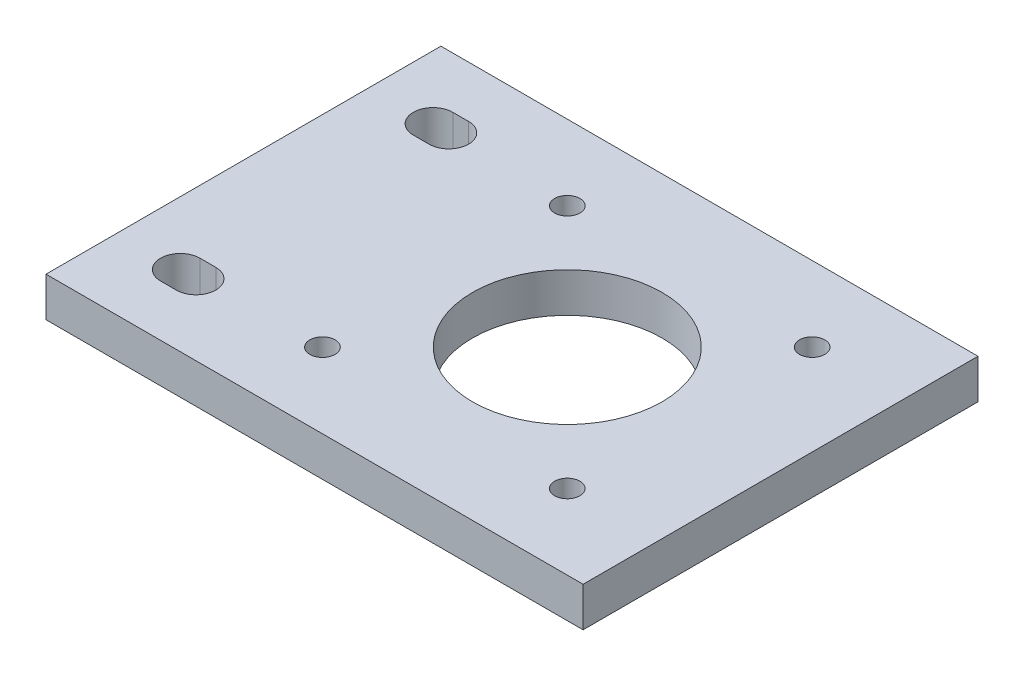
ISO-10303-21;
HEADER;
FILE_DESCRIPTION(('STEP AP214'),'2;1');
FILE_NAME('part.step','',(''),(''),'','','');
FILE_SCHEMA(('AUTOMOTIVE_DESIGN { 1 0 10303 214 1 1 1 1 }'));
ENDSEC;
DATA;
#1=APPLICATION_CONTEXT('core data for automotive mechanical design processes');
#2=APPLICATION_PROTOCOL_DEFINITION('international standard','automotive_design',2000,#1);
#3=PRODUCT_CONTEXT('',#1,'mechanical');
#4=PRODUCT('Part','Part','',(#3));
#5=PRODUCT_RELATED_PRODUCT_CATEGORY('part','',(#4));
#6=PRODUCT_DEFINITION_FORMATION('','',#4);
#7=PRODUCT_DEFINITION_CONTEXT('part definition',#1,'design');
#8=PRODUCT_DEFINITION('design','',#6,#7);
#9=PRODUCT_DEFINITION_SHAPE('','',#8);
#10=(LENGTH_UNIT() NAMED_UNIT(*) SI_UNIT(.MILLI.,.METRE.));
#11=(NAMED_UNIT(*) PLANE_ANGLE_UNIT() SI_UNIT($,.RADIAN.));
#12=(NAMED_UNIT(*) SI_UNIT($,.STERADIAN.) SOLID_ANGLE_UNIT());
#13=UNCERTAINTY_MEASURE_WITH_UNIT(LENGTH_MEASURE(1.E-05),#10,'distance_accuracy_value','');
#14=(GEOMETRIC_REPRESENTATION_CONTEXT(3) GLOBAL_UNCERTAINTY_ASSIGNED_CONTEXT((#13)) GLOBAL_UNIT_ASSIGNED_CONTEXT((#10,
#11,#12)) REPRESENTATION_CONTEXT('',''));
#15=CARTESIAN_POINT('',(0.,0.,0.));
#16=DIRECTION('',(0.,0.,1.));
#17=DIRECTION('',(1.,0.,0.));
#18=AXIS2_PLACEMENT_3D('',#15,#16,#17);
#19=CARTESIAN_POINT('',(0.,5.,0.));
#20=DIRECTION('',(0.,1.,0.));
#21=DIRECTION('',(0.,0.,1.));
#22=AXIS2_PLACEMENT_3D('',#19,#20,#21);
#23=PLANE('',#22);
#24=CARTESIAN_POINT('',(56.5,5.,40.5));
#25=DIRECTION('',(0.,1.,0.));
#26=DIRECTION('',(0.,0.,1.));
#27=AXIS2_PLACEMENT_3D('',#24,#25,#26);
#28=CIRCLE('',#27,1.60000000000001);
#29=CARTESIAN_POINT('',(56.5,5.,42.1));
#30=VERTEX_POINT('',#29);
#31=EDGE_CURVE('E232',#30,#30,#28,.T.);
#32=ORIENTED_EDGE('',*,*,#31,.F.);
#33=EDGE_LOOP('',(#32));
#34=FACE_BOUND('',#33,.T.);
#35=CARTESIAN_POINT('',(25.5,5.,9.5));
#36=DIRECTION('',(0.,1.,0.));
#37=DIRECTION('',(0.,0.,1.));
#38=AXIS2_PLACEMENT_3D('',#35,#36,#37);
#39=CIRCLE('',#38,1.6);
#40=CARTESIAN_POINT('',(25.5,5.,11.1));
#41=VERTEX_POINT('',#40);
#42=EDGE_CURVE('E248',#41,#41,#39,.T.);
#43=ORIENTED_EDGE('',*,*,#42,.F.);
#44=EDGE_LOOP('',(#43));
#45=FACE_BOUND('',#44,.T.);
#46=DIRECTION('',(0.,0.,1.));
#47=VECTOR('',#46,1.);
#48=CARTESIAN_POINT('',(0.,5.,0.));
#49=LINE('',#48,#47);
#50=CARTESIAN_POINT('',(0.,5.,0.));
#51=VERTEX_POINT('',#50);
#52=CARTESIAN_POINT('',(0.,5.,50.));
#53=VERTEX_POINT('',#52);
#54=EDGE_CURVE('E264',#51,#53,#49,.T.);
#55=ORIENTED_EDGE('',*,*,#54,.T.);
#56=DIRECTION('',(1.,0.,0.));
#57=VECTOR('',#56,1.);
#58=CARTESIAN_POINT('',(0.,5.,50.));
#59=LINE('',#58,#57);
#60=CARTESIAN_POINT('',(68.,5.,50.));
#61=VERTEX_POINT('',#60);
#62=EDGE_CURVE('E268',#53,#61,#59,.T.);
#63=ORIENTED_EDGE('',*,*,#62,.T.);
#64=DIRECTION('',(0.,0.,-1.));
#65=VECTOR('',#64,1.);
#66=CARTESIAN_POINT('',(68.,5.,0.));
#67=LINE('',#66,#65);
#68=CARTESIAN_POINT('',(68.,5.,0.));
#69=VERTEX_POINT('',#68);
#70=EDGE_CURVE('E272',#61,#69,#67,.T.);
#71=ORIENTED_EDGE('',*,*,#70,.T.);
#72=DIRECTION('',(-1.,0.,0.));
#73=VECTOR('',#72,1.);
#74=CARTESIAN_POINT('',(0.,5.,0.));
#75=LINE('',#74,#73);
#76=EDGE_CURVE('E275',#69,#51,#75,.T.);
#77=ORIENTED_EDGE('',*,*,#76,.T.);
#78=EDGE_LOOP('',(#55,#63,#71,#77));
#79=FACE_BOUND('',#78,.T.);
#80=CARTESIAN_POINT('',(41.,5.,25.));
#81=DIRECTION('',(0.,1.,0.));
#82=DIRECTION('',(0.,0.,1.));
#83=AXIS2_PLACEMENT_3D('',#80,#81,#82);
#84=CIRCLE('',#83,12.);
#85=CARTESIAN_POINT('',(41.,5.,37.));
#86=VERTEX_POINT('',#85);
#87=EDGE_CURVE('E256',#86,#86,#84,.T.);
#88=ORIENTED_EDGE('',*,*,#87,.F.);
#89=EDGE_LOOP('',(#88));
#90=FACE_BOUND('',#89,.T.);
#91=CARTESIAN_POINT('',(56.5,5.,9.5));
#92=DIRECTION('',(0.,1.,0.));
#93=DIRECTION('',(0.,0.,1.));
#94=AXIS2_PLACEMENT_3D('',#91,#92,#93);
#95=CIRCLE('',#94,1.6);
#96=CARTESIAN_POINT('',(56.5,5.,11.1));
#97=VERTEX_POINT('',#96);
#98=EDGE_CURVE('E240',#97,#97,#95,.T.);
#99=ORIENTED_EDGE('',*,*,#98,.F.);
#100=EDGE_LOOP('',(#99));
#101=FACE_BOUND('',#100,.T.);
#102=CARTESIAN_POINT('',(25.5,5.,40.5));
#103=DIRECTION('',(0.,1.,0.));
#104=DIRECTION('',(0.,0.,1.));
#105=AXIS2_PLACEMENT_3D('',#102,#103,#104);
#106=CIRCLE('',#105,1.6);
#107=CARTESIAN_POINT('',(25.5,5.,42.1));
#108=VERTEX_POINT('',#107);
#109=EDGE_CURVE('E224',#108,#108,#106,.T.);
#110=ORIENTED_EDGE('',*,*,#109,.F.);
#111=EDGE_LOOP('',(#110));
#112=FACE_BOUND('',#111,.T.);
#113=DIRECTION('',(1.,0.,0.));
#114=VECTOR('',#113,1.);
#115=CARTESIAN_POINT('',(8.,5.,11.5));
#116=LINE('',#115,#114);
#117=CARTESIAN_POINT('',(8.,5.,11.5));
#118=VERTEX_POINT('',#117);
#119=CARTESIAN_POINT('',(10.,5.,11.5));
#120=VERTEX_POINT('',#119);
#121=EDGE_CURVE('E184',#118,#120,#116,.T.);
#122=ORIENTED_EDGE('',*,*,#121,.F.);
#123=CARTESIAN_POINT('',(8.,5.,9.));
#124=DIRECTION('',(0.,1.,0.));
#125=DIRECTION('',(0.,0.,1.));
#126=AXIS2_PLACEMENT_3D('',#123,#124,#125);
#127=CIRCLE('',#126,2.5);
#128=CARTESIAN_POINT('',(8.,5.,6.5));
#129=VERTEX_POINT('',#128);
#130=EDGE_CURVE('E181',#129,#118,#127,.T.);
#131=ORIENTED_EDGE('',*,*,#130,.F.);
#132=DIRECTION('',(-1.,0.,0.));
#133=VECTOR('',#132,1.);
#134=CARTESIAN_POINT('',(8.,5.,6.5));
#135=LINE('',#134,#133);
#136=CARTESIAN_POINT('',(10.,5.,6.5));
#137=VERTEX_POINT('',#136);
#138=EDGE_CURVE('E192',#137,#129,#135,.T.);
#139=ORIENTED_EDGE('',*,*,#138,.F.);
#140=CARTESIAN_POINT('',(10.,5.,9.));
#141=DIRECTION('',(0.,1.,0.));
#142=DIRECTION('',(0.,0.,1.));
#143=AXIS2_PLACEMENT_3D('',#140,#141,#142);
#144=CIRCLE('',#143,2.5);
#145=EDGE_CURVE('E188',#120,#137,#144,.T.);
#146=ORIENTED_EDGE('',*,*,#145,.F.);
#147=EDGE_LOOP('',(#122,#131,#139,#146));
#148=FACE_BOUND('',#147,.T.);
#149=DIRECTION('',(1.,0.,0.));
#150=VECTOR('',#149,1.);
#151=CARTESIAN_POINT('',(8.00000000000001,5.,43.5));
#152=LINE('',#151,#150);
#153=CARTESIAN_POINT('',(8.00000000000001,5.,43.5));
#154=VERTEX_POINT('',#153);
#155=CARTESIAN_POINT('',(10.,5.,43.5));
#156=VERTEX_POINT('',#155);
#157=EDGE_CURVE('E142',#154,#156,#152,.T.);
#158=ORIENTED_EDGE('',*,*,#157,.F.);
#159=CARTESIAN_POINT('',(8.00000000000001,5.,41.));
#160=DIRECTION('',(0.,1.,0.));
#161=DIRECTION('',(0.,0.,1.));
#162=AXIS2_PLACEMENT_3D('',#159,#160,#161);
#163=CIRCLE('',#162,2.5);
#164=CARTESIAN_POINT('',(8.00000000000001,5.,38.5));
#165=VERTEX_POINT('',#164);
#166=EDGE_CURVE('E133',#165,#154,#163,.T.);
#167=ORIENTED_EDGE('',*,*,#166,.F.);
#168=DIRECTION('',(-1.,0.,0.));
#169=VECTOR('',#168,1.);
#170=CARTESIAN_POINT('',(8.00000000000001,5.,38.5));
#171=LINE('',#170,#169);
#172=CARTESIAN_POINT('',(10.,5.,38.5));
#173=VERTEX_POINT('',#172);
#174=EDGE_CURVE('E159',#173,#165,#171,.T.);
#175=ORIENTED_EDGE('',*,*,#174,.F.);
#176=CARTESIAN_POINT('',(10.,5.,41.));
#177=DIRECTION('',(0.,1.,0.));
#178=DIRECTION('',(0.,0.,1.));
#179=AXIS2_PLACEMENT_3D('',#176,#177,#178);
#180=CIRCLE('',#179,2.5);
#181=EDGE_CURVE('E155',#156,#173,#180,.T.);
#182=ORIENTED_EDGE('',*,*,#181,.F.);
#183=EDGE_LOOP('',(#158,#167,#175,#182));
#184=FACE_BOUND('',#183,.T.);
#185=ADVANCED_FACE('F43',(#34,#45,#79,#90,#101,#112,#148,#184),#23,.T.);
#186=CARTESIAN_POINT('',(0.,0.,0.));
#187=DIRECTION('',(0.,1.,0.));
#188=DIRECTION('',(0.,0.,1.));
#189=AXIS2_PLACEMENT_3D('',#186,#187,#188);
#190=PLANE('',#189);
#191=CARTESIAN_POINT('',(8.,0.,9.));
#192=DIRECTION('',(0.,1.,0.));
#193=DIRECTION('',(0.,0.,1.));
#194=AXIS2_PLACEMENT_3D('',#191,#192,#193);
#195=CIRCLE('',#194,2.5);
#196=CARTESIAN_POINT('',(8.,0.,6.5));
#197=VERTEX_POINT('',#196);
#198=CARTESIAN_POINT('',(8.,0.,11.5));
#199=VERTEX_POINT('',#198);
#200=EDGE_CURVE('E151',#197,#199,#195,.T.);
#201=ORIENTED_EDGE('',*,*,#200,.T.);
#202=DIRECTION('',(1.,0.,0.));
#203=VECTOR('',#202,1.);
#204=CARTESIAN_POINT('',(8.,0.,11.5));
#205=LINE('',#204,#203);
#206=CARTESIAN_POINT('',(10.,0.,11.5));
#207=VERTEX_POINT('',#206);
#208=EDGE_CURVE('E199',#199,#207,#205,.T.);
#209=ORIENTED_EDGE('',*,*,#208,.T.);
#210=CARTESIAN_POINT('',(10.,0.,9.));
#211=DIRECTION('',(0.,1.,0.));
#212=DIRECTION('',(0.,0.,1.));
#213=AXIS2_PLACEMENT_3D('',#210,#211,#212);
#214=CIRCLE('',#213,2.5);
#215=CARTESIAN_POINT('',(10.,0.,6.5));
#216=VERTEX_POINT('',#215);
#217=EDGE_CURVE('E203',#207,#216,#214,.T.);
#218=ORIENTED_EDGE('',*,*,#217,.T.);
#219=DIRECTION('',(-1.,0.,0.));
#220=VECTOR('',#219,1.);
#221=CARTESIAN_POINT('',(8.,0.,6.5));
#222=LINE('',#221,#220);
#223=EDGE_CURVE('E185',#216,#197,#222,.T.);
#224=ORIENTED_EDGE('',*,*,#223,.T.);
#225=EDGE_LOOP('',(#201,#209,#218,#224));
#226=FACE_BOUND('',#225,.T.);
#227=DIRECTION('',(0.,0.,1.));
#228=VECTOR('',#227,1.);
#229=CARTESIAN_POINT('',(0.,0.,0.));
#230=LINE('',#229,#228);
#231=CARTESIAN_POINT('',(0.,0.,0.));
#232=VERTEX_POINT('',#231);
#233=CARTESIAN_POINT('',(0.,0.,50.));
#234=VERTEX_POINT('',#233);
#235=EDGE_CURVE('E260',#232,#234,#230,.T.);
#236=ORIENTED_EDGE('',*,*,#235,.F.);
#237=DIRECTION('',(-1.,0.,0.));
#238=VECTOR('',#237,1.);
#239=CARTESIAN_POINT('',(0.,0.,0.));
#240=LINE('',#239,#238);
#241=CARTESIAN_POINT('',(68.,0.,0.));
#242=VERTEX_POINT('',#241);
#243=EDGE_CURVE('E269',#242,#232,#240,.T.);
#244=ORIENTED_EDGE('',*,*,#243,.F.);
#245=DIRECTION('',(0.,0.,-1.));
#246=VECTOR('',#245,1.);
#247=CARTESIAN_POINT('',(68.,0.,0.));
#248=LINE('',#247,#246);
#249=CARTESIAN_POINT('',(68.,0.,50.));
#250=VERTEX_POINT('',#249);
#251=EDGE_CURVE('E285',#250,#242,#248,.T.);
#252=ORIENTED_EDGE('',*,*,#251,.F.);
#253=DIRECTION('',(1.,0.,0.));
#254=VECTOR('',#253,1.);
#255=CARTESIAN_POINT('',(0.,0.,50.));
#256=LINE('',#255,#254);
#257=EDGE_CURVE('E282',#234,#250,#256,.T.);
#258=ORIENTED_EDGE('',*,*,#257,.F.);
#259=EDGE_LOOP('',(#236,#244,#252,#258));
#260=FACE_BOUND('',#259,.T.);
#261=CARTESIAN_POINT('',(41.,0.,25.));
#262=DIRECTION('',(0.,1.,0.));
#263=DIRECTION('',(0.,0.,1.));
#264=AXIS2_PLACEMENT_3D('',#261,#262,#263);
#265=CIRCLE('',#264,12.);
#266=CARTESIAN_POINT('',(41.,0.,37.));
#267=VERTEX_POINT('',#266);
#268=EDGE_CURVE('E252',#267,#267,#265,.T.);
#269=ORIENTED_EDGE('',*,*,#268,.T.);
#270=EDGE_LOOP('',(#269));
#271=FACE_BOUND('',#270,.T.);
#272=CARTESIAN_POINT('',(25.5,0.,9.5));
#273=DIRECTION('',(0.,1.,0.));
#274=DIRECTION('',(0.,0.,1.));
#275=AXIS2_PLACEMENT_3D('',#272,#273,#274);
#276=CIRCLE('',#275,1.6);
#277=CARTESIAN_POINT('',(25.5,0.,11.1));
#278=VERTEX_POINT('',#277);
#279=EDGE_CURVE('E244',#278,#278,#276,.T.);
#280=ORIENTED_EDGE('',*,*,#279,.T.);
#281=EDGE_LOOP('',(#280));
#282=FACE_BOUND('',#281,.T.);
#283=CARTESIAN_POINT('',(56.5,0.,9.5));
#284=DIRECTION('',(0.,1.,0.));
#285=DIRECTION('',(0.,0.,1.));
#286=AXIS2_PLACEMENT_3D('',#283,#284,#285);
#287=CIRCLE('',#286,1.6);
#288=CARTESIAN_POINT('',(56.5,0.,11.1));
#289=VERTEX_POINT('',#288);
#290=EDGE_CURVE('E236',#289,#289,#287,.T.);
#291=ORIENTED_EDGE('',*,*,#290,.T.);
#292=EDGE_LOOP('',(#291));
#293=FACE_BOUND('',#292,.T.);
#294=CARTESIAN_POINT('',(56.5,0.,40.5));
#295=DIRECTION('',(0.,1.,0.));
#296=DIRECTION('',(0.,0.,1.));
#297=AXIS2_PLACEMENT_3D('',#294,#295,#296);
#298=CIRCLE('',#297,1.60000000000001);
#299=CARTESIAN_POINT('',(56.5,0.,42.1));
#300=VERTEX_POINT('',#299);
#301=EDGE_CURVE('E228',#300,#300,#298,.T.);
#302=ORIENTED_EDGE('',*,*,#301,.T.);
#303=EDGE_LOOP('',(#302));
#304=FACE_BOUND('',#303,.T.);
#305=CARTESIAN_POINT('',(25.5,0.,40.5));
#306=DIRECTION('',(0.,1.,0.));
#307=DIRECTION('',(0.,0.,1.));
#308=AXIS2_PLACEMENT_3D('',#305,#306,#307);
#309=CIRCLE('',#308,1.6);
#310=CARTESIAN_POINT('',(25.5,0.,42.1));
#311=VERTEX_POINT('',#310);
#312=EDGE_CURVE('E223',#311,#311,#309,.T.);
#313=ORIENTED_EDGE('',*,*,#312,.T.);
#314=EDGE_LOOP('',(#313));
#315=FACE_BOUND('',#314,.T.);
#316=CARTESIAN_POINT('',(8.00000000000001,0.,41.));
#317=DIRECTION('',(0.,1.,0.));
#318=DIRECTION('',(0.,0.,1.));
#319=AXIS2_PLACEMENT_3D('',#316,#317,#318);
#320=CIRCLE('',#319,2.5);
#321=CARTESIAN_POINT('',(8.00000000000001,0.,38.5));
#322=VERTEX_POINT('',#321);
#323=CARTESIAN_POINT('',(8.00000000000001,0.,43.5));
#324=VERTEX_POINT('',#323);
#325=EDGE_CURVE('E67',#322,#324,#320,.T.);
#326=ORIENTED_EDGE('',*,*,#325,.T.);
#327=DIRECTION('',(1.,0.,0.));
#328=VECTOR('',#327,1.);
#329=CARTESIAN_POINT('',(8.00000000000001,0.,43.5));
#330=LINE('',#329,#328);
#331=CARTESIAN_POINT('',(10.,0.,43.5));
#332=VERTEX_POINT('',#331);
#333=EDGE_CURVE('E149',#324,#332,#330,.T.);
#334=ORIENTED_EDGE('',*,*,#333,.T.);
#335=CARTESIAN_POINT('',(10.,0.,41.));
#336=DIRECTION('',(0.,1.,0.));
#337=DIRECTION('',(0.,0.,1.));
#338=AXIS2_PLACEMENT_3D('',#335,#336,#337);
#339=CIRCLE('',#338,2.5);
#340=CARTESIAN_POINT('',(10.,0.,38.5));
#341=VERTEX_POINT('',#340);
#342=EDGE_CURVE('E168',#332,#341,#339,.T.);
#343=ORIENTED_EDGE('',*,*,#342,.T.);
#344=DIRECTION('',(-1.,0.,0.));
#345=VECTOR('',#344,1.);
#346=CARTESIAN_POINT('',(8.00000000000001,0.,38.5));
#347=LINE('',#346,#345);
#348=EDGE_CURVE('E143',#341,#322,#347,.T.);
#349=ORIENTED_EDGE('',*,*,#348,.T.);
#350=EDGE_LOOP('',(#326,#334,#343,#349));
#351=FACE_BOUND('',#350,.T.);
#352=ADVANCED_FACE('F308',(#226,#260,#271,#282,#293,#304,#315,#351),#190,.F.);
#353=CARTESIAN_POINT('',(0.,5.,0.));
#354=DIRECTION('',(1.,0.,0.));
#355=DIRECTION('',(0.,0.,-1.));
#356=AXIS2_PLACEMENT_3D('',#353,#354,#355);
#357=PLANE('',#356);
#358=ORIENTED_EDGE('',*,*,#235,.T.);
#359=DIRECTION('',(0.,-1.,0.));
#360=VECTOR('',#359,1.);
#361=CARTESIAN_POINT('',(0.,5.,50.));
#362=LINE('',#361,#360);
#363=EDGE_CURVE('E11',#53,#234,#362,.T.);
#364=ORIENTED_EDGE('',*,*,#363,.F.);
#365=ORIENTED_EDGE('',*,*,#54,.F.);
#366=DIRECTION('',(0.,-1.,0.));
#367=VECTOR('',#366,1.);
#368=CARTESIAN_POINT('',(0.,5.,0.));
#369=LINE('',#368,#367);
#370=EDGE_CURVE('E278',#51,#232,#369,.T.);
#371=ORIENTED_EDGE('',*,*,#370,.T.);
#372=EDGE_LOOP('',(#358,#364,#365,#371));
#373=FACE_BOUND('',#372,.T.);
#374=ADVANCED_FACE('F45',(#373),#357,.F.);
#375=CARTESIAN_POINT('',(0.,5.,50.));
#376=DIRECTION('',(0.,0.,-1.));
#377=DIRECTION('',(-1.,0.,0.));
#378=AXIS2_PLACEMENT_3D('',#375,#376,#377);
#379=PLANE('',#378);
#380=ORIENTED_EDGE('',*,*,#257,.T.);
#381=DIRECTION('',(0.,-1.,0.));
#382=VECTOR('',#381,1.);
#383=CARTESIAN_POINT('',(68.,5.,50.));
#384=LINE('',#383,#382);
#385=EDGE_CURVE('E52',#61,#250,#384,.T.);
#386=ORIENTED_EDGE('',*,*,#385,.F.);
#387=ORIENTED_EDGE('',*,*,#62,.F.);
#388=ORIENTED_EDGE('',*,*,#363,.T.);
#389=EDGE_LOOP('',(#380,#386,#387,#388));
#390=FACE_BOUND('',#389,.T.);
#391=ADVANCED_FACE('F319',(#390),#379,.F.);
#392=CARTESIAN_POINT('',(68.,5.,0.));
#393=DIRECTION('',(-1.,0.,0.));
#394=DIRECTION('',(0.,0.,1.));
#395=AXIS2_PLACEMENT_3D('',#392,#393,#394);
#396=PLANE('',#395);
#397=ORIENTED_EDGE('',*,*,#251,.T.);
#398=DIRECTION('',(0.,-1.,0.));
#399=VECTOR('',#398,1.);
#400=CARTESIAN_POINT('',(68.,5.,0.));
#401=LINE('',#400,#399);
#402=EDGE_CURVE('E293',#69,#242,#401,.T.);
#403=ORIENTED_EDGE('',*,*,#402,.F.);
#404=ORIENTED_EDGE('',*,*,#70,.F.);
#405=ORIENTED_EDGE('',*,*,#385,.T.);
#406=EDGE_LOOP('',(#397,#403,#404,#405));
#407=FACE_BOUND('',#406,.T.);
#408=ADVANCED_FACE('F302',(#407),#396,.F.);
#409=CARTESIAN_POINT('',(0.,5.,0.));
#410=DIRECTION('',(0.,0.,1.));
#411=DIRECTION('',(1.,0.,0.));
#412=AXIS2_PLACEMENT_3D('',#409,#410,#411);
#413=PLANE('',#412);
#414=ORIENTED_EDGE('',*,*,#243,.T.);
#415=ORIENTED_EDGE('',*,*,#370,.F.);
#416=ORIENTED_EDGE('',*,*,#76,.F.);
#417=ORIENTED_EDGE('',*,*,#402,.T.);
#418=EDGE_LOOP('',(#414,#415,#416,#417));
#419=FACE_BOUND('',#418,.T.);
#420=ADVANCED_FACE('F312',(#419),#413,.F.);
#421=CARTESIAN_POINT('',(41.,5.,25.));
#422=DIRECTION('',(0.,-1.,0.));
#423=DIRECTION('',(0.,0.,-1.));
#424=AXIS2_PLACEMENT_3D('',#421,#422,#423);
#425=CYLINDRICAL_SURFACE('',#424,12.);
#426=ORIENTED_EDGE('',*,*,#87,.T.);
#427=EDGE_LOOP('',(#426));
#428=FACE_BOUND('',#427,.T.);
#429=ORIENTED_EDGE('',*,*,#268,.F.);
#430=EDGE_LOOP('',(#429));
#431=FACE_BOUND('',#430,.T.);
#432=ADVANCED_FACE('F337',(#428,#431),#425,.F.);
#433=CARTESIAN_POINT('',(25.5,5.,9.5));
#434=DIRECTION('',(0.,-1.,0.));
#435=DIRECTION('',(0.,0.,-1.));
#436=AXIS2_PLACEMENT_3D('',#433,#434,#435);
#437=CYLINDRICAL_SURFACE('',#436,1.6);
#438=ORIENTED_EDGE('',*,*,#42,.T.);
#439=EDGE_LOOP('',(#438));
#440=FACE_BOUND('',#439,.T.);
#441=ORIENTED_EDGE('',*,*,#279,.F.);
#442=EDGE_LOOP('',(#441));
#443=FACE_BOUND('',#442,.T.);
#444=ADVANCED_FACE('F344',(#440,#443),#437,.F.);
#445=CARTESIAN_POINT('',(56.5,5.,9.5));
#446=DIRECTION('',(0.,-1.,0.));
#447=DIRECTION('',(0.,0.,-1.));
#448=AXIS2_PLACEMENT_3D('',#445,#446,#447);
#449=CYLINDRICAL_SURFACE('',#448,1.6);
#450=ORIENTED_EDGE('',*,*,#98,.T.);
#451=EDGE_LOOP('',(#450));
#452=FACE_BOUND('',#451,.T.);
#453=ORIENTED_EDGE('',*,*,#290,.F.);
#454=EDGE_LOOP('',(#453));
#455=FACE_BOUND('',#454,.T.);
#456=ADVANCED_FACE('F349',(#452,#455),#449,.F.);
#457=CARTESIAN_POINT('',(56.5,5.,40.5));
#458=DIRECTION('',(0.,-1.,0.));
#459=DIRECTION('',(0.,0.,-1.));
#460=AXIS2_PLACEMENT_3D('',#457,#458,#459);
#461=CYLINDRICAL_SURFACE('',#460,1.60000000000001);
#462=ORIENTED_EDGE('',*,*,#31,.T.);
#463=EDGE_LOOP('',(#462));
#464=FACE_BOUND('',#463,.T.);
#465=ORIENTED_EDGE('',*,*,#301,.F.);
#466=EDGE_LOOP('',(#465));
#467=FACE_BOUND('',#466,.T.);
#468=ADVANCED_FACE('F397',(#464,#467),#461,.F.);
#469=CARTESIAN_POINT('',(25.5,5.,40.5));
#470=DIRECTION('',(0.,-1.,0.));
#471=DIRECTION('',(0.,0.,-1.));
#472=AXIS2_PLACEMENT_3D('',#469,#470,#471);
#473=CYLINDRICAL_SURFACE('',#472,1.6);
#474=ORIENTED_EDGE('',*,*,#109,.T.);
#475=EDGE_LOOP('',(#474));
#476=FACE_BOUND('',#475,.T.);
#477=ORIENTED_EDGE('',*,*,#312,.F.);
#478=EDGE_LOOP('',(#477));
#479=FACE_BOUND('',#478,.T.);
#480=ADVANCED_FACE('F393',(#476,#479),#473,.F.);
#481=CARTESIAN_POINT('',(8.,5.,9.));
#482=DIRECTION('',(0.,-1.,0.));
#483=DIRECTION('',(0.,0.,-1.));
#484=AXIS2_PLACEMENT_3D('',#481,#482,#483);
#485=CYLINDRICAL_SURFACE('',#484,2.5);
#486=ORIENTED_EDGE('',*,*,#200,.F.);
#487=DIRECTION('',(0.,-1.,0.));
#488=VECTOR('',#487,1.);
#489=CARTESIAN_POINT('',(8.,5.,6.5));
#490=LINE('',#489,#488);
#491=EDGE_CURVE('E195',#129,#197,#490,.T.);
#492=ORIENTED_EDGE('',*,*,#491,.F.);
#493=ORIENTED_EDGE('',*,*,#130,.T.);
#494=DIRECTION('',(0.,-1.,0.));
#495=VECTOR('',#494,1.);
#496=CARTESIAN_POINT('',(8.,5.,11.5));
#497=LINE('',#496,#495);
#498=EDGE_CURVE('E219',#118,#199,#497,.T.);
#499=ORIENTED_EDGE('',*,*,#498,.T.);
#500=EDGE_LOOP('',(#486,#492,#493,#499));
#501=FACE_BOUND('',#500,.T.);
#502=ADVANCED_FACE('F389',(#501),#485,.F.);
#503=CARTESIAN_POINT('',(8.,5.,11.5));
#504=DIRECTION('',(0.,0.,-1.));
#505=DIRECTION('',(-1.,0.,0.));
#506=AXIS2_PLACEMENT_3D('',#503,#504,#505);
#507=PLANE('',#506);
#508=ORIENTED_EDGE('',*,*,#208,.F.);
#509=ORIENTED_EDGE('',*,*,#498,.F.);
#510=ORIENTED_EDGE('',*,*,#121,.T.);
#511=DIRECTION('',(0.,-1.,0.));
#512=VECTOR('',#511,1.);
#513=CARTESIAN_POINT('',(10.,5.,11.5));
#514=LINE('',#513,#512);
#515=EDGE_CURVE('E216',#120,#207,#514,.T.);
#516=ORIENTED_EDGE('',*,*,#515,.T.);
#517=EDGE_LOOP('',(#508,#509,#510,#516));
#518=FACE_BOUND('',#517,.T.);
#519=ADVANCED_FACE('F385',(#518),#507,.T.);
#520=CARTESIAN_POINT('',(10.,5.,9.));
#521=DIRECTION('',(0.,-1.,0.));
#522=DIRECTION('',(0.,0.,-1.));
#523=AXIS2_PLACEMENT_3D('',#520,#521,#522);
#524=CYLINDRICAL_SURFACE('',#523,2.5);
#525=ORIENTED_EDGE('',*,*,#217,.F.);
#526=ORIENTED_EDGE('',*,*,#515,.F.);
#527=ORIENTED_EDGE('',*,*,#145,.T.);
#528=DIRECTION('',(0.,-1.,0.));
#529=VECTOR('',#528,1.);
#530=CARTESIAN_POINT('',(10.,5.,6.5));
#531=LINE('',#530,#529);
#532=EDGE_CURVE('E213',#137,#216,#531,.T.);
#533=ORIENTED_EDGE('',*,*,#532,.T.);
#534=EDGE_LOOP('',(#525,#526,#527,#533));
#535=FACE_BOUND('',#534,.T.);
#536=ADVANCED_FACE('F381',(#535),#524,.F.);
#537=CARTESIAN_POINT('',(8.,5.,6.5));
#538=DIRECTION('',(0.,0.,1.));
#539=DIRECTION('',(1.,0.,0.));
#540=AXIS2_PLACEMENT_3D('',#537,#538,#539);
#541=PLANE('',#540);
#542=ORIENTED_EDGE('',*,*,#223,.F.);
#543=ORIENTED_EDGE('',*,*,#532,.F.);
#544=ORIENTED_EDGE('',*,*,#138,.T.);
#545=ORIENTED_EDGE('',*,*,#491,.T.);
#546=EDGE_LOOP('',(#542,#543,#544,#545));
#547=FACE_BOUND('',#546,.T.);
#548=ADVANCED_FACE('F378',(#547),#541,.T.);
#549=CARTESIAN_POINT('',(8.00000000000001,5.,41.));
#550=DIRECTION('',(0.,-1.,0.));
#551=DIRECTION('',(0.,0.,-1.));
#552=AXIS2_PLACEMENT_3D('',#549,#550,#551);
#553=CYLINDRICAL_SURFACE('',#552,2.5);
#554=ORIENTED_EDGE('',*,*,#325,.F.);
#555=DIRECTION('',(0.,-1.,0.));
#556=VECTOR('',#555,1.);
#557=CARTESIAN_POINT('',(8.00000000000001,5.,38.5));
#558=LINE('',#557,#556);
#559=EDGE_CURVE('E137',#165,#322,#558,.T.);
#560=ORIENTED_EDGE('',*,*,#559,.F.);
#561=ORIENTED_EDGE('',*,*,#166,.T.);
#562=DIRECTION('',(0.,-1.,0.));
#563=VECTOR('',#562,1.);
#564=CARTESIAN_POINT('',(8.00000000000001,5.,43.5));
#565=LINE('',#564,#563);
#566=EDGE_CURVE('E136',#154,#324,#565,.T.);
#567=ORIENTED_EDGE('',*,*,#566,.T.);
#568=EDGE_LOOP('',(#554,#560,#561,#567));
#569=FACE_BOUND('',#568,.T.);
#570=ADVANCED_FACE('F135',(#569),#553,.F.);
#571=CARTESIAN_POINT('',(8.00000000000001,5.,43.5));
#572=DIRECTION('',(0.,0.,-1.));
#573=DIRECTION('',(-1.,0.,0.));
#574=AXIS2_PLACEMENT_3D('',#571,#572,#573);
#575=PLANE('',#574);
#576=ORIENTED_EDGE('',*,*,#333,.F.);
#577=ORIENTED_EDGE('',*,*,#566,.F.);
#578=ORIENTED_EDGE('',*,*,#157,.T.);
#579=DIRECTION('',(0.,-1.,0.));
#580=VECTOR('',#579,1.);
#581=CARTESIAN_POINT('',(10.,5.,43.5));
#582=LINE('',#581,#580);
#583=EDGE_CURVE('E152',#156,#332,#582,.T.);
#584=ORIENTED_EDGE('',*,*,#583,.T.);
#585=EDGE_LOOP('',(#576,#577,#578,#584));
#586=FACE_BOUND('',#585,.T.);
#587=ADVANCED_FACE('F146',(#586),#575,.T.);
#588=CARTESIAN_POINT('',(10.,5.,41.));
#589=DIRECTION('',(0.,-1.,0.));
#590=DIRECTION('',(0.,0.,-1.));
#591=AXIS2_PLACEMENT_3D('',#588,#589,#590);
#592=CYLINDRICAL_SURFACE('',#591,2.5);
#593=ORIENTED_EDGE('',*,*,#342,.F.);
#594=ORIENTED_EDGE('',*,*,#583,.F.);
#595=ORIENTED_EDGE('',*,*,#181,.T.);
#596=DIRECTION('',(0.,-1.,0.));
#597=VECTOR('',#596,1.);
#598=CARTESIAN_POINT('',(10.,5.,38.5));
#599=LINE('',#598,#597);
#600=EDGE_CURVE('E59',#173,#341,#599,.T.);
#601=ORIENTED_EDGE('',*,*,#600,.T.);
#602=EDGE_LOOP('',(#593,#594,#595,#601));
#603=FACE_BOUND('',#602,.T.);
#604=ADVANCED_FACE('F366',(#603),#592,.F.);
#605=CARTESIAN_POINT('',(8.00000000000001,5.,38.5));
#606=DIRECTION('',(0.,0.,1.));
#607=DIRECTION('',(1.,0.,0.));
#608=AXIS2_PLACEMENT_3D('',#605,#606,#607);
#609=PLANE('',#608);
#610=ORIENTED_EDGE('',*,*,#348,.F.);
#611=ORIENTED_EDGE('',*,*,#600,.F.);
#612=ORIENTED_EDGE('',*,*,#174,.T.);
#613=ORIENTED_EDGE('',*,*,#559,.T.);
#614=EDGE_LOOP('',(#610,#611,#612,#613));
#615=FACE_BOUND('',#614,.T.);
#616=ADVANCED_FACE('F364',(#615),#609,.T.);
#617=CLOSED_SHELL('',(#185,#352,#374,#391,#408,#420,#432,#444,#456,#468,#480,#502,#519,#536,
#548,#570,#587,#604,#616));
#618=MANIFOLD_SOLID_BREP('B2',#617);
#619=ADVANCED_BREP_SHAPE_REPRESENTATION('',(#18,#618),#14);
#620=SHAPE_DEFINITION_REPRESENTATION(#9,#619);
ENDSEC;
END-ISO-10303-21;
